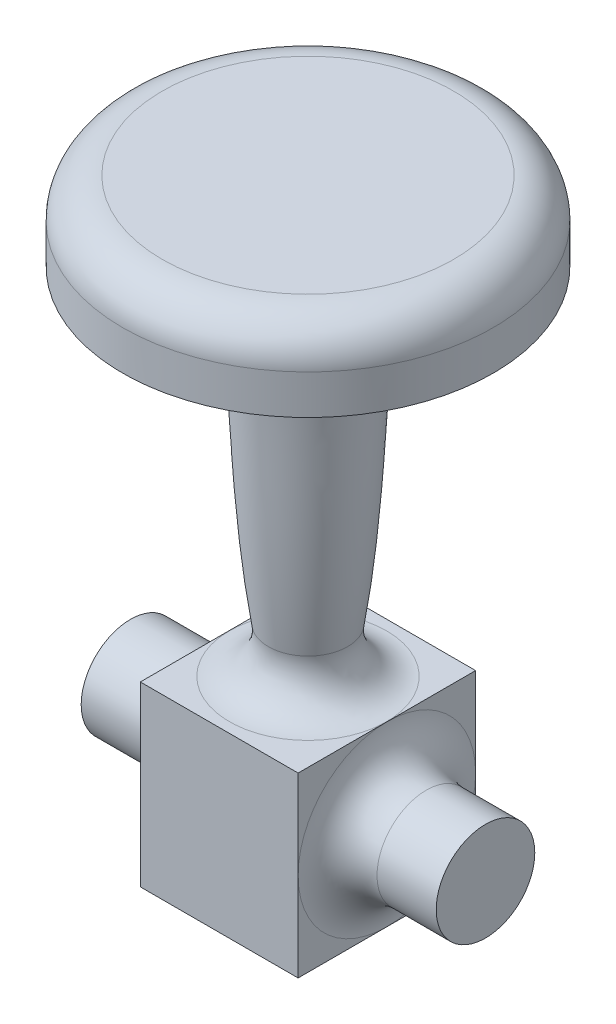
ISO-10303-21;
HEADER;
FILE_DESCRIPTION(('STEP AP214'),'2;1');
FILE_NAME('part.step','',(''),(''),'','','');
FILE_SCHEMA(('AUTOMOTIVE_DESIGN { 1 0 10303 214 1 1 1 1 }'));
ENDSEC;
DATA;
#1=APPLICATION_CONTEXT('core data for automotive mechanical design processes');
#2=APPLICATION_PROTOCOL_DEFINITION('international standard','automotive_design',2000,#1);
#3=PRODUCT_CONTEXT('',#1,'mechanical');
#4=PRODUCT('Part','Part','',(#3));
#5=PRODUCT_RELATED_PRODUCT_CATEGORY('part','',(#4));
#6=PRODUCT_DEFINITION_FORMATION('','',#4);
#7=PRODUCT_DEFINITION_CONTEXT('part definition',#1,'design');
#8=PRODUCT_DEFINITION('design','',#6,#7);
#9=PRODUCT_DEFINITION_SHAPE('','',#8);
#10=(LENGTH_UNIT() NAMED_UNIT(*) SI_UNIT(.MILLI.,.METRE.));
#11=(NAMED_UNIT(*) PLANE_ANGLE_UNIT() SI_UNIT($,.RADIAN.));
#12=(NAMED_UNIT(*) SI_UNIT($,.STERADIAN.) SOLID_ANGLE_UNIT());
#13=UNCERTAINTY_MEASURE_WITH_UNIT(LENGTH_MEASURE(1.E-05),#10,'distance_accuracy_value','');
#14=(GEOMETRIC_REPRESENTATION_CONTEXT(3) GLOBAL_UNCERTAINTY_ASSIGNED_CONTEXT((#13)) GLOBAL_UNIT_ASSIGNED_CONTEXT((#10,
#11,#12)) REPRESENTATION_CONTEXT('',''));
#15=CARTESIAN_POINT('',(0.,0.,0.));
#16=DIRECTION('',(0.,0.,1.));
#17=DIRECTION('',(1.,0.,0.));
#18=AXIS2_PLACEMENT_3D('',#15,#16,#17);
#19=CARTESIAN_POINT('',(0.,0.,0.));
#20=DIRECTION('',(-1.,0.,0.));
#21=DIRECTION('',(0.,0.,1.));
#22=AXIS2_PLACEMENT_3D('',#19,#20,#21);
#23=PLANE('',#22);
#24=DIRECTION('',(0.,-1.,0.));
#25=VECTOR('',#24,1.);
#26=CARTESIAN_POINT('',(0.,0.,0.));
#27=LINE('',#26,#25);
#28=CARTESIAN_POINT('',(0.,5.715,0.));
#29=VERTEX_POINT('',#28);
#30=CARTESIAN_POINT('',(0.,0.,0.));
#31=VERTEX_POINT('',#30);
#32=EDGE_CURVE('E127',#29,#31,#27,.T.);
#33=ORIENTED_EDGE('',*,*,#32,.F.);
#34=CARTESIAN_POINT('',(0.,5.715,-5.715));
#35=DIRECTION('',(-1.,0.,0.));
#36=DIRECTION('',(0.,0.,1.));
#37=AXIS2_PLACEMENT_3D('',#34,#35,#36);
#38=CIRCLE('',#37,5.715);
#39=CARTESIAN_POINT('',(0.,0.,-5.715));
#40=VERTEX_POINT('',#39);
#41=EDGE_CURVE('E155',#29,#40,#38,.F.);
#42=ORIENTED_EDGE('',*,*,#41,.T.);
#43=DIRECTION('',(0.,0.,-1.));
#44=VECTOR('',#43,1.);
#45=CARTESIAN_POINT('',(0.,0.,0.));
#46=LINE('',#45,#44);
#47=EDGE_CURVE('E217',#31,#40,#46,.T.);
#48=ORIENTED_EDGE('',*,*,#47,.F.);
#49=EDGE_LOOP('',(#33,#42,#48));
#50=FACE_BOUND('',#49,.T.);
#51=ADVANCED_FACE('F35',(#50),#23,.T.);
#52=CARTESIAN_POINT('',(0.,0.,-11.43));
#53=VERTEX_POINT('',#52);
#54=EDGE_CURVE('E231',#40,#53,#46,.T.);
#55=ORIENTED_EDGE('',*,*,#54,.F.);
#56=CARTESIAN_POINT('',(0.,5.715,-5.715));
#57=DIRECTION('',(-1.,0.,0.));
#58=DIRECTION('',(0.,0.,1.));
#59=AXIS2_PLACEMENT_3D('',#56,#57,#58);
#60=CIRCLE('',#59,5.715);
#61=CARTESIAN_POINT('',(0.,5.715,-11.43));
#62=VERTEX_POINT('',#61);
#63=EDGE_CURVE('E50',#40,#62,#60,.F.);
#64=ORIENTED_EDGE('',*,*,#63,.T.);
#65=DIRECTION('',(0.,1.,0.));
#66=VECTOR('',#65,1.);
#67=CARTESIAN_POINT('',(0.,0.,-11.43));
#68=LINE('',#67,#66);
#69=EDGE_CURVE('E216',#53,#62,#68,.T.);
#70=ORIENTED_EDGE('',*,*,#69,.F.);
#71=EDGE_LOOP('',(#55,#64,#70));
#72=FACE_BOUND('',#71,.T.);
#73=ADVANCED_FACE('F178',(#72),#23,.T.);
#74=CARTESIAN_POINT('',(0.,11.43,-11.43));
#75=VERTEX_POINT('',#74);
#76=EDGE_CURVE('E210',#62,#75,#68,.T.);
#77=ORIENTED_EDGE('',*,*,#76,.F.);
#78=CARTESIAN_POINT('',(0.,5.715,-5.715));
#79=DIRECTION('',(-1.,0.,0.));
#80=DIRECTION('',(0.,0.,1.));
#81=AXIS2_PLACEMENT_3D('',#78,#79,#80);
#82=CIRCLE('',#81,5.715);
#83=CARTESIAN_POINT('',(0.,11.43,-5.715));
#84=VERTEX_POINT('',#83);
#85=EDGE_CURVE('E152',#62,#84,#82,.F.);
#86=ORIENTED_EDGE('',*,*,#85,.T.);
#87=DIRECTION('',(0.,0.,1.));
#88=VECTOR('',#87,1.);
#89=CARTESIAN_POINT('',(0.,11.43,0.));
#90=LINE('',#89,#88);
#91=EDGE_CURVE('E112',#75,#84,#90,.T.);
#92=ORIENTED_EDGE('',*,*,#91,.F.);
#93=EDGE_LOOP('',(#77,#86,#92));
#94=FACE_BOUND('',#93,.T.);
#95=ADVANCED_FACE('F185',(#94),#23,.T.);
#96=CARTESIAN_POINT('',(10.16,0.,0.));
#97=DIRECTION('',(-1.,0.,0.));
#98=DIRECTION('',(0.,0.,1.));
#99=AXIS2_PLACEMENT_3D('',#96,#97,#98);
#100=PLANE('',#99);
#101=DIRECTION('',(0.,-1.,0.));
#102=VECTOR('',#101,1.);
#103=CARTESIAN_POINT('',(10.16,0.,0.));
#104=LINE('',#103,#102);
#105=CARTESIAN_POINT('',(10.16,11.43,0.));
#106=VERTEX_POINT('',#105);
#107=CARTESIAN_POINT('',(10.16,5.715,0.));
#108=VERTEX_POINT('',#107);
#109=EDGE_CURVE('E111',#106,#108,#104,.T.);
#110=ORIENTED_EDGE('',*,*,#109,.T.);
#111=CARTESIAN_POINT('',(10.16,5.715,-5.715));
#112=DIRECTION('',(-1.,0.,0.));
#113=DIRECTION('',(0.,0.,1.));
#114=AXIS2_PLACEMENT_3D('',#111,#112,#113);
#115=CIRCLE('',#114,5.715);
#116=CARTESIAN_POINT('',(10.16,11.43,-5.715));
#117=VERTEX_POINT('',#116);
#118=EDGE_CURVE('E141',#108,#117,#115,.T.);
#119=ORIENTED_EDGE('',*,*,#118,.T.);
#120=DIRECTION('',(0.,0.,1.));
#121=VECTOR('',#120,1.);
#122=CARTESIAN_POINT('',(10.16,11.43,0.));
#123=LINE('',#122,#121);
#124=EDGE_CURVE('E248',#117,#106,#123,.T.);
#125=ORIENTED_EDGE('',*,*,#124,.T.);
#126=EDGE_LOOP('',(#110,#119,#125));
#127=FACE_BOUND('',#126,.T.);
#128=ADVANCED_FACE('F199',(#127),#100,.F.);
#129=CARTESIAN_POINT('',(10.16,11.43,-11.43));
#130=VERTEX_POINT('',#129);
#131=EDGE_CURVE('E234',#130,#117,#123,.T.);
#132=ORIENTED_EDGE('',*,*,#131,.T.);
#133=CARTESIAN_POINT('',(10.16,5.715,-5.715));
#134=DIRECTION('',(-1.,0.,0.));
#135=DIRECTION('',(0.,0.,1.));
#136=AXIS2_PLACEMENT_3D('',#133,#134,#135);
#137=CIRCLE('',#136,5.715);
#138=CARTESIAN_POINT('',(10.16,5.715,-11.43));
#139=VERTEX_POINT('',#138);
#140=EDGE_CURVE('E139',#117,#139,#137,.T.);
#141=ORIENTED_EDGE('',*,*,#140,.T.);
#142=DIRECTION('',(0.,1.,0.));
#143=VECTOR('',#142,1.);
#144=CARTESIAN_POINT('',(10.16,0.,-11.43));
#145=LINE('',#144,#143);
#146=EDGE_CURVE('E122',#139,#130,#145,.T.);
#147=ORIENTED_EDGE('',*,*,#146,.T.);
#148=EDGE_LOOP('',(#132,#141,#147));
#149=FACE_BOUND('',#148,.T.);
#150=ADVANCED_FACE('F207',(#149),#100,.F.);
#151=CARTESIAN_POINT('',(10.16,0.,-11.43));
#152=VERTEX_POINT('',#151);
#153=EDGE_CURVE('E244',#152,#139,#145,.T.);
#154=ORIENTED_EDGE('',*,*,#153,.T.);
#155=CARTESIAN_POINT('',(10.16,5.715,-5.715));
#156=DIRECTION('',(-1.,0.,0.));
#157=DIRECTION('',(0.,0.,1.));
#158=AXIS2_PLACEMENT_3D('',#155,#156,#157);
#159=CIRCLE('',#158,5.715);
#160=CARTESIAN_POINT('',(10.16,0.,-5.715));
#161=VERTEX_POINT('',#160);
#162=EDGE_CURVE('E131',#139,#161,#159,.T.);
#163=ORIENTED_EDGE('',*,*,#162,.T.);
#164=DIRECTION('',(0.,0.,-1.));
#165=VECTOR('',#164,1.);
#166=CARTESIAN_POINT('',(10.16,0.,0.));
#167=LINE('',#166,#165);
#168=EDGE_CURVE('E121',#161,#152,#167,.T.);
#169=ORIENTED_EDGE('',*,*,#168,.T.);
#170=EDGE_LOOP('',(#154,#163,#169));
#171=FACE_BOUND('',#170,.T.);
#172=ADVANCED_FACE('F200',(#171),#100,.F.);
#173=CARTESIAN_POINT('',(10.16,0.,0.));
#174=DIRECTION('',(0.,0.,-1.));
#175=DIRECTION('',(-1.,0.,0.));
#176=AXIS2_PLACEMENT_3D('',#173,#174,#175);
#177=PLANE('',#176);
#178=CARTESIAN_POINT('',(0.,11.43,0.));
#179=VERTEX_POINT('',#178);
#180=EDGE_CURVE('E225',#179,#29,#27,.T.);
#181=ORIENTED_EDGE('',*,*,#180,.T.);
#182=ORIENTED_EDGE('',*,*,#32,.T.);
#183=DIRECTION('',(-1.,0.,0.));
#184=VECTOR('',#183,1.);
#185=CARTESIAN_POINT('',(10.16,0.,0.));
#186=LINE('',#185,#184);
#187=CARTESIAN_POINT('',(10.16,0.,0.));
#188=VERTEX_POINT('',#187);
#189=EDGE_CURVE('E119',#188,#31,#186,.T.);
#190=ORIENTED_EDGE('',*,*,#189,.F.);
#191=EDGE_CURVE('E101',#108,#188,#104,.T.);
#192=ORIENTED_EDGE('',*,*,#191,.F.);
#193=ORIENTED_EDGE('',*,*,#109,.F.);
#194=DIRECTION('',(-1.,0.,0.));
#195=VECTOR('',#194,1.);
#196=CARTESIAN_POINT('',(10.16,11.43,0.));
#197=LINE('',#196,#195);
#198=EDGE_CURVE('E230',#106,#179,#197,.T.);
#199=ORIENTED_EDGE('',*,*,#198,.T.);
#200=EDGE_LOOP('',(#181,#182,#190,#192,#193,#199));
#201=FACE_BOUND('',#200,.T.);
#202=ADVANCED_FACE('F125',(#201),#177,.F.);
#203=CARTESIAN_POINT('',(10.16,0.,0.));
#204=DIRECTION('',(0.,1.,0.));
#205=DIRECTION('',(0.,0.,1.));
#206=AXIS2_PLACEMENT_3D('',#203,#204,#205);
#207=PLANE('',#206);
#208=ORIENTED_EDGE('',*,*,#47,.T.);
#209=ORIENTED_EDGE('',*,*,#54,.T.);
#210=DIRECTION('',(-1.,0.,0.));
#211=VECTOR('',#210,1.);
#212=CARTESIAN_POINT('',(10.16,0.,-11.43));
#213=LINE('',#212,#211);
#214=EDGE_CURVE('E129',#152,#53,#213,.T.);
#215=ORIENTED_EDGE('',*,*,#214,.F.);
#216=ORIENTED_EDGE('',*,*,#168,.F.);
#217=EDGE_CURVE('E104',#188,#161,#167,.T.);
#218=ORIENTED_EDGE('',*,*,#217,.F.);
#219=ORIENTED_EDGE('',*,*,#189,.T.);
#220=EDGE_LOOP('',(#208,#209,#215,#216,#218,#219));
#221=FACE_BOUND('',#220,.T.);
#222=ADVANCED_FACE('F118',(#221),#207,.F.);
#223=CARTESIAN_POINT('',(10.16,0.,-11.43));
#224=DIRECTION('',(0.,0.,1.));
#225=DIRECTION('',(1.,0.,0.));
#226=AXIS2_PLACEMENT_3D('',#223,#224,#225);
#227=PLANE('',#226);
#228=ORIENTED_EDGE('',*,*,#69,.T.);
#229=ORIENTED_EDGE('',*,*,#76,.T.);
#230=DIRECTION('',(-1.,0.,0.));
#231=VECTOR('',#230,1.);
#232=CARTESIAN_POINT('',(10.16,11.43,-11.43));
#233=LINE('',#232,#231);
#234=EDGE_CURVE('E134',#130,#75,#233,.T.);
#235=ORIENTED_EDGE('',*,*,#234,.F.);
#236=ORIENTED_EDGE('',*,*,#146,.F.);
#237=ORIENTED_EDGE('',*,*,#153,.F.);
#238=ORIENTED_EDGE('',*,*,#214,.T.);
#239=EDGE_LOOP('',(#228,#229,#235,#236,#237,#238));
#240=FACE_BOUND('',#239,.T.);
#241=ADVANCED_FACE('F219',(#240),#227,.F.);
#242=CARTESIAN_POINT('',(10.16,11.43,0.));
#243=DIRECTION('',(0.,-1.,0.));
#244=DIRECTION('',(0.,0.,-1.));
#245=AXIS2_PLACEMENT_3D('',#242,#243,#244);
#246=PLANE('',#245);
#247=CARTESIAN_POINT('',(5.08,11.43,-5.715));
#248=DIRECTION('',(0.,-1.,0.));
#249=DIRECTION('',(0.,0.,-1.));
#250=AXIS2_PLACEMENT_3D('',#247,#248,#249);
#251=CIRCLE('',#250,5.06388195644904);
#252=CARTESIAN_POINT('',(5.08,11.43,-10.778881956449));
#253=VERTEX_POINT('',#252);
#254=EDGE_CURVE('E157',#253,#253,#251,.T.);
#255=ORIENTED_EDGE('',*,*,#254,.T.);
#256=EDGE_LOOP('',(#255));
#257=FACE_BOUND('',#256,.T.);
#258=ORIENTED_EDGE('',*,*,#91,.T.);
#259=EDGE_CURVE('E221',#84,#179,#90,.T.);
#260=ORIENTED_EDGE('',*,*,#259,.T.);
#261=ORIENTED_EDGE('',*,*,#198,.F.);
#262=ORIENTED_EDGE('',*,*,#124,.F.);
#263=ORIENTED_EDGE('',*,*,#131,.F.);
#264=ORIENTED_EDGE('',*,*,#234,.T.);
#265=EDGE_LOOP('',(#258,#260,#261,#262,#263,#264));
#266=FACE_BOUND('',#265,.T.);
#267=ADVANCED_FACE('F198',(#257,#266),#246,.F.);
#268=ORIENTED_EDGE('',*,*,#217,.T.);
#269=CARTESIAN_POINT('',(10.16,5.715,-5.715));
#270=DIRECTION('',(-1.,0.,0.));
#271=DIRECTION('',(0.,0.,1.));
#272=AXIS2_PLACEMENT_3D('',#269,#270,#271);
#273=CIRCLE('',#272,5.715);
#274=EDGE_CURVE('E106',#161,#108,#273,.T.);
#275=ORIENTED_EDGE('',*,*,#274,.T.);
#276=ORIENTED_EDGE('',*,*,#191,.T.);
#277=EDGE_LOOP('',(#268,#275,#276));
#278=FACE_BOUND('',#277,.T.);
#279=ADVANCED_FACE('F103',(#278),#100,.F.);
#280=ORIENTED_EDGE('',*,*,#259,.F.);
#281=CARTESIAN_POINT('',(0.,5.715,-5.715));
#282=DIRECTION('',(-1.,0.,0.));
#283=DIRECTION('',(0.,0.,1.));
#284=AXIS2_PLACEMENT_3D('',#281,#282,#283);
#285=CIRCLE('',#284,5.715);
#286=EDGE_CURVE('E150',#84,#29,#285,.F.);
#287=ORIENTED_EDGE('',*,*,#286,.T.);
#288=ORIENTED_EDGE('',*,*,#180,.F.);
#289=EDGE_LOOP('',(#280,#287,#288));
#290=FACE_BOUND('',#289,.T.);
#291=ADVANCED_FACE('F181',(#290),#23,.T.);
#292=CARTESIAN_POINT('',(-6.35,0.,0.));
#293=DIRECTION('',(-1.,0.,0.));
#294=DIRECTION('',(0.,0.,1.));
#295=AXIS2_PLACEMENT_3D('',#292,#293,#294);
#296=PLANE('',#295);
#297=CARTESIAN_POINT('',(-6.35,5.715,-5.715));
#298=DIRECTION('',(-1.,0.,0.));
#299=DIRECTION('',(0.,0.,1.));
#300=AXIS2_PLACEMENT_3D('',#297,#298,#299);
#301=CIRCLE('',#300,3.175);
#302=CARTESIAN_POINT('',(-6.35,5.715,-2.54));
#303=VERTEX_POINT('',#302);
#304=EDGE_CURVE('E226',#303,#303,#301,.F.);
#305=ORIENTED_EDGE('',*,*,#304,.F.);
#306=EDGE_LOOP('',(#305));
#307=FACE_BOUND('',#306,.T.);
#308=ADVANCED_FACE('F189',(#307),#296,.T.);
#309=CARTESIAN_POINT('',(-21.6802561210692,5.715,-5.715));
#310=DIRECTION('',(1.,0.,0.));
#311=DIRECTION('',(0.,0.,-1.));
#312=AXIS2_PLACEMENT_3D('',#309,#310,#311);
#313=CYLINDRICAL_SURFACE('',#312,3.175);
#314=CARTESIAN_POINT('',(-2.54,5.715,-5.715));
#315=DIRECTION('',(-1.,0.,0.));
#316=DIRECTION('',(0.,0.,1.));
#317=AXIS2_PLACEMENT_3D('',#314,#315,#316);
#318=CIRCLE('',#317,3.175);
#319=CARTESIAN_POINT('',(-2.54,5.715,-2.54));
#320=VERTEX_POINT('',#319);
#321=EDGE_CURVE('E147',#320,#320,#318,.T.);
#322=ORIENTED_EDGE('',*,*,#321,.T.);
#323=EDGE_LOOP('',(#322));
#324=FACE_BOUND('',#323,.T.);
#325=ORIENTED_EDGE('',*,*,#304,.T.);
#326=EDGE_LOOP('',(#325));
#327=FACE_BOUND('',#326,.T.);
#328=ADVANCED_FACE('F195',(#324,#327),#313,.T.);
#329=CARTESIAN_POINT('',(12.7,5.715,-5.715));
#330=DIRECTION('',(-1.,0.,0.));
#331=DIRECTION('',(0.,0.,1.));
#332=AXIS2_PLACEMENT_3D('',#329,#330,#331);
#333=CIRCLE('',#332,3.175);
#334=CARTESIAN_POINT('',(12.7,5.715,-2.54));
#335=VERTEX_POINT('',#334);
#336=EDGE_CURVE('E144',#335,#335,#333,.F.);
#337=ORIENTED_EDGE('',*,*,#336,.T.);
#338=EDGE_LOOP('',(#337));
#339=FACE_BOUND('',#338,.T.);
#340=CARTESIAN_POINT('',(16.51,5.715,-5.715));
#341=DIRECTION('',(1.,0.,0.));
#342=DIRECTION('',(0.,0.,-1.));
#343=AXIS2_PLACEMENT_3D('',#340,#341,#342);
#344=CIRCLE('',#343,3.175);
#345=CARTESIAN_POINT('',(16.51,5.715,-8.89));
#346=VERTEX_POINT('',#345);
#347=EDGE_CURVE('E285',#346,#346,#344,.T.);
#348=ORIENTED_EDGE('',*,*,#347,.F.);
#349=EDGE_LOOP('',(#348));
#350=FACE_BOUND('',#349,.T.);
#351=ADVANCED_FACE('F259',(#339,#350),#313,.T.);
#352=CARTESIAN_POINT('',(16.51,5.715,-5.715));
#353=DIRECTION('',(1.,0.,0.));
#354=DIRECTION('',(0.,0.,-1.));
#355=AXIS2_PLACEMENT_3D('',#352,#353,#354);
#356=PLANE('',#355);
#357=ORIENTED_EDGE('',*,*,#347,.T.);
#358=EDGE_LOOP('',(#357));
#359=FACE_BOUND('',#358,.T.);
#360=ADVANCED_FACE('F261',(#359),#356,.T.);
#361=CARTESIAN_POINT('',(5.08,39.37,-5.715));
#362=DIRECTION('',(0.,1.,0.));
#363=DIRECTION('',(0.,0.,1.));
#364=AXIS2_PLACEMENT_3D('',#361,#362,#363);
#365=PLANE('',#364);
#366=CARTESIAN_POINT('',(5.08,39.37,-5.715));
#367=DIRECTION('',(0.,1.,0.));
#368=DIRECTION('',(0.,0.,1.));
#369=AXIS2_PLACEMENT_3D('',#366,#367,#368);
#370=CIRCLE('',#369,9.38759230176274);
#371=CARTESIAN_POINT('',(5.08,39.37,3.67259230176274));
#372=VERTEX_POINT('',#371);
#373=EDGE_CURVE('E12',#372,#372,#370,.T.);
#374=ORIENTED_EDGE('',*,*,#373,.T.);
#375=EDGE_LOOP('',(#374));
#376=FACE_BOUND('',#375,.T.);
#377=ADVANCED_FACE('F264',(#376),#365,.T.);
#378=CARTESIAN_POINT('',(5.08,11.43,-5.715));
#379=DIRECTION('',(0.,-1.,0.));
#380=DIRECTION('',(0.,0.,-1.));
#381=AXIS2_PLACEMENT_3D('',#378,#379,#380);
#382=CYLINDRICAL_SURFACE('',#381,11.9275923017627);
#383=CARTESIAN_POINT('',(5.08,36.83,-5.715));
#384=DIRECTION('',(0.,1.,0.));
#385=DIRECTION('',(0.,0.,1.));
#386=AXIS2_PLACEMENT_3D('',#383,#384,#385);
#387=CIRCLE('',#386,11.9275923017627);
#388=CARTESIAN_POINT('',(5.08,36.83,6.21259230176274));
#389=VERTEX_POINT('',#388);
#390=EDGE_CURVE('E43',#389,#389,#387,.F.);
#391=ORIENTED_EDGE('',*,*,#390,.T.);
#392=EDGE_LOOP('',(#391));
#393=FACE_BOUND('',#392,.T.);
#394=CARTESIAN_POINT('',(5.08,34.29,-5.715));
#395=DIRECTION('',(0.,-1.,0.));
#396=DIRECTION('',(0.,0.,-1.));
#397=AXIS2_PLACEMENT_3D('',#394,#395,#396);
#398=CIRCLE('',#397,11.9275923017627);
#399=CARTESIAN_POINT('',(5.08,34.29,-17.6425923017627));
#400=VERTEX_POINT('',#399);
#401=EDGE_CURVE('E279',#400,#400,#398,.T.);
#402=ORIENTED_EDGE('',*,*,#401,.F.);
#403=EDGE_LOOP('',(#402));
#404=FACE_BOUND('',#403,.T.);
#405=ADVANCED_FACE('F165',(#393,#404),#382,.T.);
#406=CARTESIAN_POINT('',(7.112,11.43,-5.715));
#407=CARTESIAN_POINT('',(10.4189926816935,27.6452491088461,-5.715));
#408=CARTESIAN_POINT('',(5.95907651614869,41.9440887772998,-5.715));
#409=CARTESIAN_POINT('',(17.0075923017627,34.29,-5.715));
#410=B_SPLINE_CURVE_WITH_KNOTS('',3,(#406,#407,#408,#409),.UNSPECIFIED.,.F.,.F.,(4,4),(0.,1.),.UNSPECIFIED.);
#411=CARTESIAN_POINT('',(5.08,11.43,-5.715));
#412=DIRECTION('',(0.,-1.,0.));
#413=AXIS1_PLACEMENT('',#411,#412);
#414=SURFACE_OF_REVOLUTION('',#410,#413);
#415=CARTESIAN_POINT('',(5.08,14.3566065676439,-5.715));
#416=DIRECTION('',(0.,-1.,0.));
#417=DIRECTION('',(0.,0.,-1.));
#418=AXIS2_PLACEMENT_3D('',#415,#416,#417);
#419=CIRCLE('',#418,2.55347653862214);
#420=CARTESIAN_POINT('',(5.08,14.3566065676439,-8.26847653862214));
#421=VERTEX_POINT('',#420);
#422=EDGE_CURVE('E160',#421,#421,#419,.F.);
#423=ORIENTED_EDGE('',*,*,#422,.T.);
#424=EDGE_LOOP('',(#423));
#425=FACE_BOUND('',#424,.T.);
#426=ORIENTED_EDGE('',*,*,#401,.T.);
#427=EDGE_LOOP('',(#426));
#428=FACE_BOUND('',#427,.T.);
#429=ADVANCED_FACE('F271',(#425,#428),#414,.F.);
#430=CARTESIAN_POINT('',(12.7,5.715,-5.715));
#431=DIRECTION('',(-1.,0.,0.));
#432=DIRECTION('',(0.,0.,1.));
#433=AXIS2_PLACEMENT_3D('',#430,#431,#432);
#434=TOROIDAL_SURFACE('',#433,5.715,2.54);
#435=ORIENTED_EDGE('',*,*,#336,.F.);
#436=EDGE_LOOP('',(#435));
#437=FACE_BOUND('',#436,.T.);
#438=ORIENTED_EDGE('',*,*,#140,.F.);
#439=ORIENTED_EDGE('',*,*,#118,.F.);
#440=ORIENTED_EDGE('',*,*,#274,.F.);
#441=ORIENTED_EDGE('',*,*,#162,.F.);
#442=EDGE_LOOP('',(#438,#439,#440,#441));
#443=FACE_BOUND('',#442,.T.);
#444=ADVANCED_FACE('F250',(#437,#443),#434,.F.);
#445=CARTESIAN_POINT('',(-2.54,5.715,-5.715));
#446=DIRECTION('',(-1.,0.,0.));
#447=DIRECTION('',(0.,0.,1.));
#448=AXIS2_PLACEMENT_3D('',#445,#446,#447);
#449=TOROIDAL_SURFACE('',#448,5.715,2.54);
#450=ORIENTED_EDGE('',*,*,#63,.F.);
#451=ORIENTED_EDGE('',*,*,#41,.F.);
#452=ORIENTED_EDGE('',*,*,#286,.F.);
#453=ORIENTED_EDGE('',*,*,#85,.F.);
#454=EDGE_LOOP('',(#450,#451,#452,#453));
#455=FACE_BOUND('',#454,.T.);
#456=ORIENTED_EDGE('',*,*,#321,.F.);
#457=EDGE_LOOP('',(#456));
#458=FACE_BOUND('',#457,.T.);
#459=ADVANCED_FACE('F174',(#455,#458),#449,.F.);
#460=CARTESIAN_POINT('',(5.08,13.97,-5.715));
#461=DIRECTION('',(0.,-1.,0.));
#462=DIRECTION('',(0.,0.,-1.));
#463=AXIS2_PLACEMENT_3D('',#460,#461,#462);
#464=TOROIDAL_SURFACE('',#463,5.06388195644904,2.54);
#465=ORIENTED_EDGE('',*,*,#422,.F.);
#466=EDGE_LOOP('',(#465));
#467=FACE_BOUND('',#466,.T.);
#468=ORIENTED_EDGE('',*,*,#254,.F.);
#469=EDGE_LOOP('',(#468));
#470=FACE_BOUND('',#469,.T.);
#471=ADVANCED_FACE('F169',(#467,#470),#464,.F.);
#472=CARTESIAN_POINT('',(5.08,36.83,-5.715));
#473=DIRECTION('',(0.,1.,0.));
#474=DIRECTION('',(0.,0.,1.));
#475=AXIS2_PLACEMENT_3D('',#472,#473,#474);
#476=TOROIDAL_SURFACE('',#475,9.38759230176274,2.54);
#477=ORIENTED_EDGE('',*,*,#373,.F.);
#478=EDGE_LOOP('',(#477));
#479=FACE_BOUND('',#478,.T.);
#480=ORIENTED_EDGE('',*,*,#390,.F.);
#481=EDGE_LOOP('',(#480));
#482=FACE_BOUND('',#481,.T.);
#483=ADVANCED_FACE('F37',(#479,#482),#476,.T.);
#484=CLOSED_SHELL('',(#51,#73,#95,#128,#150,#172,#202,#222,#241,#267,#279,#291,#308,#328,#351,
#360,#377,#405,#429,#444,#459,#471,#483));
#485=MANIFOLD_SOLID_BREP('B2',#484);
#486=ADVANCED_BREP_SHAPE_REPRESENTATION('',(#18,#485),#14);
#487=SHAPE_DEFINITION_REPRESENTATION(#9,#486);
ENDSEC;
END-ISO-10303-21;
